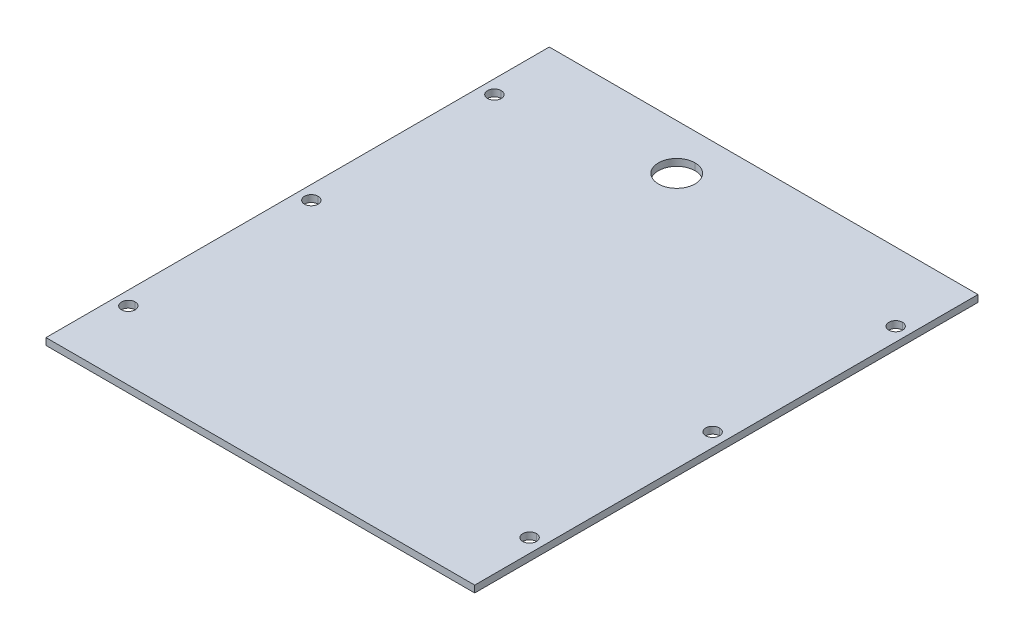
ISO-10303-21;
HEADER;
FILE_DESCRIPTION(('STEP AP214'),'2;1');
FILE_NAME('part.step','',(''),(''),'','','');
FILE_SCHEMA(('AUTOMOTIVE_DESIGN { 1 0 10303 214 1 1 1 1 }'));
ENDSEC;
DATA;
#1=APPLICATION_CONTEXT('core data for automotive mechanical design processes');
#2=APPLICATION_PROTOCOL_DEFINITION('international standard','automotive_design',2000,#1);
#3=PRODUCT_CONTEXT('',#1,'mechanical');
#4=PRODUCT('Part','Part','',(#3));
#5=PRODUCT_RELATED_PRODUCT_CATEGORY('part','',(#4));
#6=PRODUCT_DEFINITION_FORMATION('','',#4);
#7=PRODUCT_DEFINITION_CONTEXT('part definition',#1,'design');
#8=PRODUCT_DEFINITION('design','',#6,#7);
#9=PRODUCT_DEFINITION_SHAPE('','',#8);
#10=(LENGTH_UNIT() NAMED_UNIT(*) SI_UNIT(.MILLI.,.METRE.));
#11=(NAMED_UNIT(*) PLANE_ANGLE_UNIT() SI_UNIT($,.RADIAN.));
#12=(NAMED_UNIT(*) SI_UNIT($,.STERADIAN.) SOLID_ANGLE_UNIT());
#13=UNCERTAINTY_MEASURE_WITH_UNIT(LENGTH_MEASURE(1.E-05),#10,'distance_accuracy_value','');
#14=(GEOMETRIC_REPRESENTATION_CONTEXT(3) GLOBAL_UNCERTAINTY_ASSIGNED_CONTEXT((#13)) GLOBAL_UNIT_ASSIGNED_CONTEXT((#10,
#11,#12)) REPRESENTATION_CONTEXT('',''));
#15=CARTESIAN_POINT('',(0.,0.,0.));
#16=DIRECTION('',(0.,0.,1.));
#17=DIRECTION('',(1.,0.,0.));
#18=AXIS2_PLACEMENT_3D('',#15,#16,#17);
#19=CARTESIAN_POINT('',(37.85,-0.000999999999999916,-100.));
#20=DIRECTION('',(0.,1.,0.));
#21=DIRECTION('',(0.,0.,1.));
#22=AXIS2_PLACEMENT_3D('',#19,#20,#21);
#23=CYLINDRICAL_SURFACE('',#22,4.);
#24=DIRECTION('',(0.,1.,0.));
#25=VECTOR('',#24,1.);
#26=CARTESIAN_POINT('',(37.85,-0.000999999999999916,-104.));
#27=LINE('',#26,#25);
#28=CARTESIAN_POINT('',(37.85,0.,-104.));
#29=VERTEX_POINT('',#28);
#30=CARTESIAN_POINT('',(37.85,1.5,-104.));
#31=VERTEX_POINT('',#30);
#32=EDGE_CURVE('E198',#29,#31,#27,.T.);
#33=ORIENTED_EDGE('',*,*,#32,.F.);
#34=CARTESIAN_POINT('',(37.85,0.,-100.));
#35=DIRECTION('',(0.,1.,0.));
#36=DIRECTION('',(0.,0.,-1.));
#37=AXIS2_PLACEMENT_3D('',#34,#35,#36);
#38=CIRCLE('',#37,4.);
#39=CARTESIAN_POINT('',(37.85,0.,-96.));
#40=VERTEX_POINT('',#39);
#41=EDGE_CURVE('E185',#40,#29,#38,.T.);
#42=ORIENTED_EDGE('',*,*,#41,.F.);
#43=DIRECTION('',(0.,1.,0.));
#44=VECTOR('',#43,1.);
#45=CARTESIAN_POINT('',(37.85,-0.000999999999999916,-96.));
#46=LINE('',#45,#44);
#47=CARTESIAN_POINT('',(37.85,1.5,-96.));
#48=VERTEX_POINT('',#47);
#49=EDGE_CURVE('E207',#40,#48,#46,.T.);
#50=ORIENTED_EDGE('',*,*,#49,.T.);
#51=CARTESIAN_POINT('',(37.85,1.5,-100.));
#52=DIRECTION('',(0.,1.,0.));
#53=DIRECTION('',(0.,0.,1.));
#54=AXIS2_PLACEMENT_3D('',#51,#52,#53);
#55=CIRCLE('',#54,4.);
#56=EDGE_CURVE('E199',#48,#31,#55,.T.);
#57=ORIENTED_EDGE('',*,*,#56,.T.);
#58=EDGE_LOOP('',(#33,#42,#50,#57));
#59=FACE_BOUND('',#58,.T.);
#60=ADVANCED_FACE('F17',(#59),#23,.F.);
#61=CARTESIAN_POINT('',(3.,-0.000999999999999916,-95.));
#62=DIRECTION('',(0.,1.,0.));
#63=DIRECTION('',(0.,0.,1.));
#64=AXIS2_PLACEMENT_3D('',#61,#62,#63);
#65=CYLINDRICAL_SURFACE('',#64,1.5);
#66=DIRECTION('',(0.,1.,0.));
#67=VECTOR('',#66,1.);
#68=CARTESIAN_POINT('',(3.,-0.000999999999999916,-96.5));
#69=LINE('',#68,#67);
#70=CARTESIAN_POINT('',(3.,0.,-96.5));
#71=VERTEX_POINT('',#70);
#72=CARTESIAN_POINT('',(3.,1.5,-96.5));
#73=VERTEX_POINT('',#72);
#74=EDGE_CURVE('E214',#71,#73,#69,.T.);
#75=ORIENTED_EDGE('',*,*,#74,.F.);
#76=CARTESIAN_POINT('',(3.,0.,-95.));
#77=DIRECTION('',(0.,1.,0.));
#78=DIRECTION('',(0.,0.,-1.));
#79=AXIS2_PLACEMENT_3D('',#76,#77,#78);
#80=CIRCLE('',#79,1.5);
#81=CARTESIAN_POINT('',(3.,0.,-93.5));
#82=VERTEX_POINT('',#81);
#83=EDGE_CURVE('E194',#82,#71,#80,.T.);
#84=ORIENTED_EDGE('',*,*,#83,.F.);
#85=DIRECTION('',(0.,1.,0.));
#86=VECTOR('',#85,1.);
#87=CARTESIAN_POINT('',(3.,-0.000999999999999916,-93.5));
#88=LINE('',#87,#86);
#89=CARTESIAN_POINT('',(3.,1.5,-93.5));
#90=VERTEX_POINT('',#89);
#91=EDGE_CURVE('E237',#82,#90,#88,.T.);
#92=ORIENTED_EDGE('',*,*,#91,.T.);
#93=CARTESIAN_POINT('',(3.,1.5,-95.));
#94=DIRECTION('',(0.,1.,0.));
#95=DIRECTION('',(0.,0.,-1.));
#96=AXIS2_PLACEMENT_3D('',#93,#94,#95);
#97=CIRCLE('',#96,1.5);
#98=EDGE_CURVE('E371',#90,#73,#97,.T.);
#99=ORIENTED_EDGE('',*,*,#98,.T.);
#100=EDGE_LOOP('',(#75,#84,#92,#99));
#101=FACE_BOUND('',#100,.T.);
#102=ADVANCED_FACE('F434',(#101),#65,.F.);
#103=CARTESIAN_POINT('',(3.,-0.000999999999999916,-55.));
#104=DIRECTION('',(0.,1.,0.));
#105=DIRECTION('',(0.,0.,1.));
#106=AXIS2_PLACEMENT_3D('',#103,#104,#105);
#107=CYLINDRICAL_SURFACE('',#106,1.5);
#108=DIRECTION('',(0.,1.,0.));
#109=VECTOR('',#108,1.);
#110=CARTESIAN_POINT('',(3.,-0.000999999999999916,-56.5));
#111=LINE('',#110,#109);
#112=CARTESIAN_POINT('',(3.,0.,-56.5));
#113=VERTEX_POINT('',#112);
#114=CARTESIAN_POINT('',(3.,1.5,-56.5));
#115=VERTEX_POINT('',#114);
#116=EDGE_CURVE('E236',#113,#115,#111,.T.);
#117=ORIENTED_EDGE('',*,*,#116,.F.);
#118=CARTESIAN_POINT('',(3.,0.,-55.));
#119=DIRECTION('',(0.,1.,0.));
#120=DIRECTION('',(0.,0.,-1.));
#121=AXIS2_PLACEMENT_3D('',#118,#119,#120);
#122=CIRCLE('',#121,1.5);
#123=CARTESIAN_POINT('',(3.,0.,-53.5));
#124=VERTEX_POINT('',#123);
#125=EDGE_CURVE('E272',#124,#113,#122,.T.);
#126=ORIENTED_EDGE('',*,*,#125,.F.);
#127=DIRECTION('',(0.,1.,0.));
#128=VECTOR('',#127,1.);
#129=CARTESIAN_POINT('',(3.,-0.000999999999999916,-53.5));
#130=LINE('',#129,#128);
#131=CARTESIAN_POINT('',(3.,1.5,-53.5));
#132=VERTEX_POINT('',#131);
#133=EDGE_CURVE('E226',#124,#132,#130,.T.);
#134=ORIENTED_EDGE('',*,*,#133,.T.);
#135=CARTESIAN_POINT('',(3.,1.5,-55.));
#136=DIRECTION('',(0.,1.,0.));
#137=DIRECTION('',(0.,0.,-1.));
#138=AXIS2_PLACEMENT_3D('',#135,#136,#137);
#139=CIRCLE('',#138,1.5);
#140=EDGE_CURVE('E376',#132,#115,#139,.T.);
#141=ORIENTED_EDGE('',*,*,#140,.T.);
#142=EDGE_LOOP('',(#117,#126,#134,#141));
#143=FACE_BOUND('',#142,.T.);
#144=ADVANCED_FACE('F438',(#143),#107,.F.);
#145=CARTESIAN_POINT('',(3.,-0.000999999999999916,-15.));
#146=DIRECTION('',(0.,1.,0.));
#147=DIRECTION('',(0.,0.,1.));
#148=AXIS2_PLACEMENT_3D('',#145,#146,#147);
#149=CYLINDRICAL_SURFACE('',#148,1.5);
#150=DIRECTION('',(0.,1.,0.));
#151=VECTOR('',#150,1.);
#152=CARTESIAN_POINT('',(3.,-0.000999999999999916,-16.5));
#153=LINE('',#152,#151);
#154=CARTESIAN_POINT('',(3.,0.,-16.5));
#155=VERTEX_POINT('',#154);
#156=CARTESIAN_POINT('',(3.,1.5,-16.5));
#157=VERTEX_POINT('',#156);
#158=EDGE_CURVE('E259',#155,#157,#153,.T.);
#159=ORIENTED_EDGE('',*,*,#158,.F.);
#160=CARTESIAN_POINT('',(3.,0.,-15.));
#161=DIRECTION('',(0.,1.,0.));
#162=DIRECTION('',(0.,0.,-1.));
#163=AXIS2_PLACEMENT_3D('',#160,#161,#162);
#164=CIRCLE('',#163,1.5);
#165=CARTESIAN_POINT('',(3.,0.,-13.5));
#166=VERTEX_POINT('',#165);
#167=EDGE_CURVE('E275',#166,#155,#164,.T.);
#168=ORIENTED_EDGE('',*,*,#167,.F.);
#169=DIRECTION('',(0.,1.,0.));
#170=VECTOR('',#169,1.);
#171=CARTESIAN_POINT('',(3.,-0.000999999999999916,-13.5));
#172=LINE('',#171,#170);
#173=CARTESIAN_POINT('',(3.,1.5,-13.5));
#174=VERTEX_POINT('',#173);
#175=EDGE_CURVE('E250',#166,#174,#172,.T.);
#176=ORIENTED_EDGE('',*,*,#175,.T.);
#177=CARTESIAN_POINT('',(3.,1.5,-15.));
#178=DIRECTION('',(0.,1.,0.));
#179=DIRECTION('',(0.,0.,-1.));
#180=AXIS2_PLACEMENT_3D('',#177,#178,#179);
#181=CIRCLE('',#180,1.5);
#182=EDGE_CURVE('E379',#174,#157,#181,.T.);
#183=ORIENTED_EDGE('',*,*,#182,.T.);
#184=EDGE_LOOP('',(#159,#168,#176,#183));
#185=FACE_BOUND('',#184,.T.);
#186=ADVANCED_FACE('F394',(#185),#149,.F.);
#187=CARTESIAN_POINT('',(90.7,-0.000999999999999916,-15.));
#188=DIRECTION('',(0.,1.,0.));
#189=DIRECTION('',(0.,0.,1.));
#190=AXIS2_PLACEMENT_3D('',#187,#188,#189);
#191=CYLINDRICAL_SURFACE('',#190,1.5);
#192=DIRECTION('',(0.,1.,0.));
#193=VECTOR('',#192,1.);
#194=CARTESIAN_POINT('',(90.7,-0.000999999999999916,-16.5));
#195=LINE('',#194,#193);
#196=CARTESIAN_POINT('',(90.7,0.,-16.5));
#197=VERTEX_POINT('',#196);
#198=CARTESIAN_POINT('',(90.7,1.5,-16.5));
#199=VERTEX_POINT('',#198);
#200=EDGE_CURVE('E297',#197,#199,#195,.T.);
#201=ORIENTED_EDGE('',*,*,#200,.F.);
#202=CARTESIAN_POINT('',(90.7,0.,-15.));
#203=DIRECTION('',(0.,1.,0.));
#204=DIRECTION('',(0.,0.,-1.));
#205=AXIS2_PLACEMENT_3D('',#202,#203,#204);
#206=CIRCLE('',#205,1.5);
#207=CARTESIAN_POINT('',(90.7,0.,-13.5));
#208=VERTEX_POINT('',#207);
#209=EDGE_CURVE('E268',#208,#197,#206,.T.);
#210=ORIENTED_EDGE('',*,*,#209,.F.);
#211=DIRECTION('',(0.,1.,0.));
#212=VECTOR('',#211,1.);
#213=CARTESIAN_POINT('',(90.7,-0.000999999999999916,-13.5));
#214=LINE('',#213,#212);
#215=CARTESIAN_POINT('',(90.7,1.5,-13.5));
#216=VERTEX_POINT('',#215);
#217=EDGE_CURVE('E305',#208,#216,#214,.T.);
#218=ORIENTED_EDGE('',*,*,#217,.T.);
#219=CARTESIAN_POINT('',(90.7,1.5,-15.));
#220=DIRECTION('',(0.,1.,0.));
#221=DIRECTION('',(0.,0.,1.));
#222=AXIS2_PLACEMENT_3D('',#219,#220,#221);
#223=CIRCLE('',#222,1.5);
#224=EDGE_CURVE('E241',#216,#199,#223,.T.);
#225=ORIENTED_EDGE('',*,*,#224,.T.);
#226=EDGE_LOOP('',(#201,#210,#218,#225));
#227=FACE_BOUND('',#226,.T.);
#228=ADVANCED_FACE('F446',(#227),#191,.F.);
#229=CARTESIAN_POINT('',(90.7,-0.000999999999999916,-55.));
#230=DIRECTION('',(0.,1.,0.));
#231=DIRECTION('',(0.,0.,1.));
#232=AXIS2_PLACEMENT_3D('',#229,#230,#231);
#233=CYLINDRICAL_SURFACE('',#232,1.5);
#234=DIRECTION('',(0.,1.,0.));
#235=VECTOR('',#234,1.);
#236=CARTESIAN_POINT('',(90.7,-0.000999999999999916,-56.5));
#237=LINE('',#236,#235);
#238=CARTESIAN_POINT('',(90.7,0.,-56.5));
#239=VERTEX_POINT('',#238);
#240=CARTESIAN_POINT('',(90.7,1.5,-56.5));
#241=VERTEX_POINT('',#240);
#242=EDGE_CURVE('E318',#239,#241,#237,.T.);
#243=ORIENTED_EDGE('',*,*,#242,.F.);
#244=CARTESIAN_POINT('',(90.7,0.,-55.));
#245=DIRECTION('',(0.,1.,0.));
#246=DIRECTION('',(0.,0.,-1.));
#247=AXIS2_PLACEMENT_3D('',#244,#245,#246);
#248=CIRCLE('',#247,1.5);
#249=CARTESIAN_POINT('',(90.7,0.,-53.5));
#250=VERTEX_POINT('',#249);
#251=EDGE_CURVE('E25',#250,#239,#248,.T.);
#252=ORIENTED_EDGE('',*,*,#251,.F.);
#253=DIRECTION('',(0.,1.,0.));
#254=VECTOR('',#253,1.);
#255=CARTESIAN_POINT('',(90.7,-0.000999999999999916,-53.5));
#256=LINE('',#255,#254);
#257=CARTESIAN_POINT('',(90.7,1.5,-53.5));
#258=VERTEX_POINT('',#257);
#259=EDGE_CURVE('E328',#250,#258,#256,.T.);
#260=ORIENTED_EDGE('',*,*,#259,.T.);
#261=CARTESIAN_POINT('',(90.7,1.5,-55.));
#262=DIRECTION('',(0.,1.,0.));
#263=DIRECTION('',(0.,0.,1.));
#264=AXIS2_PLACEMENT_3D('',#261,#262,#263);
#265=CIRCLE('',#264,1.5);
#266=EDGE_CURVE('E238',#258,#241,#265,.T.);
#267=ORIENTED_EDGE('',*,*,#266,.T.);
#268=EDGE_LOOP('',(#243,#252,#260,#267));
#269=FACE_BOUND('',#268,.T.);
#270=ADVANCED_FACE('F428',(#269),#233,.F.);
#271=CARTESIAN_POINT('',(90.7,-0.000999999999999916,-95.));
#272=DIRECTION('',(0.,1.,0.));
#273=DIRECTION('',(0.,0.,1.));
#274=AXIS2_PLACEMENT_3D('',#271,#272,#273);
#275=CYLINDRICAL_SURFACE('',#274,1.5);
#276=DIRECTION('',(0.,1.,0.));
#277=VECTOR('',#276,1.);
#278=CARTESIAN_POINT('',(90.7,-0.000999999999999916,-96.5));
#279=LINE('',#278,#277);
#280=CARTESIAN_POINT('',(90.7,0.,-96.5));
#281=VERTEX_POINT('',#280);
#282=CARTESIAN_POINT('',(90.7,1.5,-96.5));
#283=VERTEX_POINT('',#282);
#284=EDGE_CURVE('E336',#281,#283,#279,.T.);
#285=ORIENTED_EDGE('',*,*,#284,.F.);
#286=CARTESIAN_POINT('',(90.7,0.,-95.));
#287=DIRECTION('',(0.,1.,0.));
#288=DIRECTION('',(0.,0.,-1.));
#289=AXIS2_PLACEMENT_3D('',#286,#287,#288);
#290=CIRCLE('',#289,1.5);
#291=CARTESIAN_POINT('',(90.7,0.,-93.5));
#292=VERTEX_POINT('',#291);
#293=EDGE_CURVE('E11',#292,#281,#290,.T.);
#294=ORIENTED_EDGE('',*,*,#293,.F.);
#295=DIRECTION('',(0.,1.,0.));
#296=VECTOR('',#295,1.);
#297=CARTESIAN_POINT('',(90.7,-0.000999999999999916,-93.5));
#298=LINE('',#297,#296);
#299=CARTESIAN_POINT('',(90.7,1.5,-93.5));
#300=VERTEX_POINT('',#299);
#301=EDGE_CURVE('E288',#292,#300,#298,.T.);
#302=ORIENTED_EDGE('',*,*,#301,.T.);
#303=CARTESIAN_POINT('',(90.7,1.5,-95.));
#304=DIRECTION('',(0.,1.,0.));
#305=DIRECTION('',(0.,0.,1.));
#306=AXIS2_PLACEMENT_3D('',#303,#304,#305);
#307=CIRCLE('',#306,1.5);
#308=EDGE_CURVE('E195',#300,#283,#307,.T.);
#309=ORIENTED_EDGE('',*,*,#308,.T.);
#310=EDGE_LOOP('',(#285,#294,#302,#309));
#311=FACE_BOUND('',#310,.T.);
#312=ADVANCED_FACE('F421',(#311),#275,.F.);
#313=CARTESIAN_POINT('',(0.,0.,0.));
#314=DIRECTION('',(0.,-1.,0.));
#315=DIRECTION('',(0.,0.,-1.));
#316=AXIS2_PLACEMENT_3D('',#313,#314,#315);
#317=PLANE('',#316);
#318=ORIENTED_EDGE('',*,*,#293,.T.);
#319=CARTESIAN_POINT('',(90.7,0.,-95.));
#320=DIRECTION('',(0.,1.,0.));
#321=DIRECTION('',(0.,0.,-1.));
#322=AXIS2_PLACEMENT_3D('',#319,#320,#321);
#323=CIRCLE('',#322,1.5);
#324=EDGE_CURVE('E332',#281,#292,#323,.T.);
#325=ORIENTED_EDGE('',*,*,#324,.T.);
#326=EDGE_LOOP('',(#318,#325));
#327=FACE_BOUND('',#326,.T.);
#328=ORIENTED_EDGE('',*,*,#251,.T.);
#329=CARTESIAN_POINT('',(90.7,0.,-55.));
#330=DIRECTION('',(0.,1.,0.));
#331=DIRECTION('',(0.,0.,-1.));
#332=AXIS2_PLACEMENT_3D('',#329,#330,#331);
#333=CIRCLE('',#332,1.5);
#334=EDGE_CURVE('E309',#239,#250,#333,.T.);
#335=ORIENTED_EDGE('',*,*,#334,.T.);
#336=EDGE_LOOP('',(#328,#335));
#337=FACE_BOUND('',#336,.T.);
#338=ORIENTED_EDGE('',*,*,#209,.T.);
#339=CARTESIAN_POINT('',(90.7,0.,-15.));
#340=DIRECTION('',(0.,1.,0.));
#341=DIRECTION('',(0.,0.,-1.));
#342=AXIS2_PLACEMENT_3D('',#339,#340,#341);
#343=CIRCLE('',#342,1.5);
#344=EDGE_CURVE('E254',#197,#208,#343,.T.);
#345=ORIENTED_EDGE('',*,*,#344,.T.);
#346=EDGE_LOOP('',(#338,#345));
#347=FACE_BOUND('',#346,.T.);
#348=ORIENTED_EDGE('',*,*,#167,.T.);
#349=CARTESIAN_POINT('',(3.,0.,-15.));
#350=DIRECTION('',(0.,1.,0.));
#351=DIRECTION('',(0.,0.,-1.));
#352=AXIS2_PLACEMENT_3D('',#349,#350,#351);
#353=CIRCLE('',#352,1.5);
#354=EDGE_CURVE('E230',#155,#166,#353,.T.);
#355=ORIENTED_EDGE('',*,*,#354,.T.);
#356=EDGE_LOOP('',(#348,#355));
#357=FACE_BOUND('',#356,.T.);
#358=ORIENTED_EDGE('',*,*,#125,.T.);
#359=CARTESIAN_POINT('',(3.,0.,-55.));
#360=DIRECTION('',(0.,1.,0.));
#361=DIRECTION('',(0.,0.,-1.));
#362=AXIS2_PLACEMENT_3D('',#359,#360,#361);
#363=CIRCLE('',#362,1.5);
#364=EDGE_CURVE('E232',#113,#124,#363,.T.);
#365=ORIENTED_EDGE('',*,*,#364,.T.);
#366=EDGE_LOOP('',(#358,#365));
#367=FACE_BOUND('',#366,.T.);
#368=ORIENTED_EDGE('',*,*,#83,.T.);
#369=CARTESIAN_POINT('',(3.,0.,-95.));
#370=DIRECTION('',(0.,1.,0.));
#371=DIRECTION('',(0.,0.,-1.));
#372=AXIS2_PLACEMENT_3D('',#369,#370,#371);
#373=CIRCLE('',#372,1.5);
#374=EDGE_CURVE('E219',#71,#82,#373,.T.);
#375=ORIENTED_EDGE('',*,*,#374,.T.);
#376=EDGE_LOOP('',(#368,#375));
#377=FACE_BOUND('',#376,.T.);
#378=ORIENTED_EDGE('',*,*,#41,.T.);
#379=CARTESIAN_POINT('',(37.85,0.,-100.));
#380=DIRECTION('',(0.,1.,0.));
#381=DIRECTION('',(0.,0.,-1.));
#382=AXIS2_PLACEMENT_3D('',#379,#380,#381);
#383=CIRCLE('',#382,4.);
#384=EDGE_CURVE('E189',#29,#40,#383,.T.);
#385=ORIENTED_EDGE('',*,*,#384,.T.);
#386=EDGE_LOOP('',(#378,#385));
#387=FACE_BOUND('',#386,.T.);
#388=DIRECTION('',(0.,0.,1.));
#389=VECTOR('',#388,1.);
#390=CARTESIAN_POINT('',(0.,0.,0.));
#391=LINE('',#390,#389);
#392=CARTESIAN_POINT('',(0.,0.,-110.));
#393=VERTEX_POINT('',#392);
#394=CARTESIAN_POINT('',(0.,0.,0.));
#395=VERTEX_POINT('',#394);
#396=EDGE_CURVE('E292',#393,#395,#391,.T.);
#397=ORIENTED_EDGE('',*,*,#396,.F.);
#398=DIRECTION('',(-1.,0.,0.));
#399=VECTOR('',#398,1.);
#400=CARTESIAN_POINT('',(0.,0.,-110.));
#401=LINE('',#400,#399);
#402=CARTESIAN_POINT('',(93.7,0.,-110.));
#403=VERTEX_POINT('',#402);
#404=EDGE_CURVE('E49',#403,#393,#401,.T.);
#405=ORIENTED_EDGE('',*,*,#404,.F.);
#406=DIRECTION('',(0.,0.,-1.));
#407=VECTOR('',#406,1.);
#408=CARTESIAN_POINT('',(93.7,0.,0.));
#409=LINE('',#408,#407);
#410=CARTESIAN_POINT('',(93.7,0.,0.));
#411=VERTEX_POINT('',#410);
#412=EDGE_CURVE('E359',#411,#403,#409,.T.);
#413=ORIENTED_EDGE('',*,*,#412,.F.);
#414=DIRECTION('',(1.,0.,0.));
#415=VECTOR('',#414,1.);
#416=CARTESIAN_POINT('',(0.,0.,0.));
#417=LINE('',#416,#415);
#418=EDGE_CURVE('E247',#395,#411,#417,.T.);
#419=ORIENTED_EDGE('',*,*,#418,.F.);
#420=EDGE_LOOP('',(#397,#405,#413,#419));
#421=FACE_BOUND('',#420,.T.);
#422=ADVANCED_FACE('F187',(#327,#337,#347,#357,#367,#377,#387,#421),#317,.T.);
#423=CARTESIAN_POINT('',(0.,1.5,0.));
#424=DIRECTION('',(0.,-1.,0.));
#425=DIRECTION('',(0.,0.,-1.));
#426=AXIS2_PLACEMENT_3D('',#423,#424,#425);
#427=PLANE('',#426);
#428=ORIENTED_EDGE('',*,*,#308,.F.);
#429=CARTESIAN_POINT('',(90.7,1.5,-95.));
#430=DIRECTION('',(0.,1.,0.));
#431=DIRECTION('',(0.,0.,1.));
#432=AXIS2_PLACEMENT_3D('',#429,#430,#431);
#433=CIRCLE('',#432,1.5);
#434=EDGE_CURVE('E293',#283,#300,#433,.T.);
#435=ORIENTED_EDGE('',*,*,#434,.F.);
#436=EDGE_LOOP('',(#428,#435));
#437=FACE_BOUND('',#436,.T.);
#438=ORIENTED_EDGE('',*,*,#266,.F.);
#439=CARTESIAN_POINT('',(90.7,1.5,-55.));
#440=DIRECTION('',(0.,1.,0.));
#441=DIRECTION('',(0.,0.,1.));
#442=AXIS2_PLACEMENT_3D('',#439,#440,#441);
#443=CIRCLE('',#442,1.5);
#444=EDGE_CURVE('E324',#241,#258,#443,.T.);
#445=ORIENTED_EDGE('',*,*,#444,.F.);
#446=EDGE_LOOP('',(#438,#445));
#447=FACE_BOUND('',#446,.T.);
#448=ORIENTED_EDGE('',*,*,#224,.F.);
#449=CARTESIAN_POINT('',(90.7,1.5,-15.));
#450=DIRECTION('',(0.,1.,0.));
#451=DIRECTION('',(0.,0.,1.));
#452=AXIS2_PLACEMENT_3D('',#449,#450,#451);
#453=CIRCLE('',#452,1.5);
#454=EDGE_CURVE('E301',#199,#216,#453,.T.);
#455=ORIENTED_EDGE('',*,*,#454,.F.);
#456=EDGE_LOOP('',(#448,#455));
#457=FACE_BOUND('',#456,.T.);
#458=ORIENTED_EDGE('',*,*,#182,.F.);
#459=CARTESIAN_POINT('',(3.,1.5,-15.));
#460=DIRECTION('',(0.,1.,0.));
#461=DIRECTION('',(0.,0.,-1.));
#462=AXIS2_PLACEMENT_3D('',#459,#460,#461);
#463=CIRCLE('',#462,1.5);
#464=EDGE_CURVE('E255',#157,#174,#463,.T.);
#465=ORIENTED_EDGE('',*,*,#464,.F.);
#466=EDGE_LOOP('',(#458,#465));
#467=FACE_BOUND('',#466,.T.);
#468=ORIENTED_EDGE('',*,*,#140,.F.);
#469=CARTESIAN_POINT('',(3.,1.5,-55.));
#470=DIRECTION('',(0.,1.,0.));
#471=DIRECTION('',(0.,0.,-1.));
#472=AXIS2_PLACEMENT_3D('',#469,#470,#471);
#473=CIRCLE('',#472,1.5);
#474=EDGE_CURVE('E231',#115,#132,#473,.T.);
#475=ORIENTED_EDGE('',*,*,#474,.F.);
#476=EDGE_LOOP('',(#468,#475));
#477=FACE_BOUND('',#476,.T.);
#478=ORIENTED_EDGE('',*,*,#98,.F.);
#479=CARTESIAN_POINT('',(3.,1.5,-95.));
#480=DIRECTION('',(0.,1.,0.));
#481=DIRECTION('',(0.,0.,-1.));
#482=AXIS2_PLACEMENT_3D('',#479,#480,#481);
#483=CIRCLE('',#482,1.5);
#484=EDGE_CURVE('E218',#73,#90,#483,.T.);
#485=ORIENTED_EDGE('',*,*,#484,.F.);
#486=EDGE_LOOP('',(#478,#485));
#487=FACE_BOUND('',#486,.T.);
#488=ORIENTED_EDGE('',*,*,#56,.F.);
#489=CARTESIAN_POINT('',(37.85,1.5,-100.));
#490=DIRECTION('',(0.,1.,0.));
#491=DIRECTION('',(0.,0.,1.));
#492=AXIS2_PLACEMENT_3D('',#489,#490,#491);
#493=CIRCLE('',#492,4.);
#494=EDGE_CURVE('E204',#31,#48,#493,.T.);
#495=ORIENTED_EDGE('',*,*,#494,.F.);
#496=EDGE_LOOP('',(#488,#495));
#497=FACE_BOUND('',#496,.T.);
#498=DIRECTION('',(0.,0.,1.));
#499=VECTOR('',#498,1.);
#500=CARTESIAN_POINT('',(0.,1.5,0.));
#501=LINE('',#500,#499);
#502=CARTESIAN_POINT('',(0.,1.5,-110.));
#503=VERTEX_POINT('',#502);
#504=CARTESIAN_POINT('',(0.,1.5,0.));
#505=VERTEX_POINT('',#504);
#506=EDGE_CURVE('E314',#503,#505,#501,.T.);
#507=ORIENTED_EDGE('',*,*,#506,.T.);
#508=DIRECTION('',(1.,0.,0.));
#509=VECTOR('',#508,1.);
#510=CARTESIAN_POINT('',(0.,1.5,0.));
#511=LINE('',#510,#509);
#512=CARTESIAN_POINT('',(93.7,1.5,0.));
#513=VERTEX_POINT('',#512);
#514=EDGE_CURVE('E246',#505,#513,#511,.T.);
#515=ORIENTED_EDGE('',*,*,#514,.T.);
#516=DIRECTION('',(0.,0.,-1.));
#517=VECTOR('',#516,1.);
#518=CARTESIAN_POINT('',(93.7,1.5,0.));
#519=LINE('',#518,#517);
#520=CARTESIAN_POINT('',(93.7,1.5,-110.));
#521=VERTEX_POINT('',#520);
#522=EDGE_CURVE('E220',#513,#521,#519,.T.);
#523=ORIENTED_EDGE('',*,*,#522,.T.);
#524=DIRECTION('',(-1.,0.,0.));
#525=VECTOR('',#524,1.);
#526=CARTESIAN_POINT('',(0.,1.5,-110.));
#527=LINE('',#526,#525);
#528=EDGE_CURVE('E38',#521,#503,#527,.T.);
#529=ORIENTED_EDGE('',*,*,#528,.T.);
#530=EDGE_LOOP('',(#507,#515,#523,#529));
#531=FACE_BOUND('',#530,.T.);
#532=ADVANCED_FACE('F399',(#437,#447,#457,#467,#477,#487,#497,#531),#427,.F.);
#533=CARTESIAN_POINT('',(0.,1.5,-110.));
#534=DIRECTION('',(0.,0.,1.));
#535=DIRECTION('',(1.,0.,0.));
#536=AXIS2_PLACEMENT_3D('',#533,#534,#535);
#537=PLANE('',#536);
#538=ORIENTED_EDGE('',*,*,#404,.T.);
#539=DIRECTION('',(0.,-1.,0.));
#540=VECTOR('',#539,1.);
#541=CARTESIAN_POINT('',(0.,1.5,-110.));
#542=LINE('',#541,#540);
#543=EDGE_CURVE('E310',#503,#393,#542,.T.);
#544=ORIENTED_EDGE('',*,*,#543,.F.);
#545=ORIENTED_EDGE('',*,*,#528,.F.);
#546=DIRECTION('',(0.,-1.,0.));
#547=VECTOR('',#546,1.);
#548=CARTESIAN_POINT('',(93.7,1.5,-110.));
#549=LINE('',#548,#547);
#550=EDGE_CURVE('E223',#521,#403,#549,.T.);
#551=ORIENTED_EDGE('',*,*,#550,.T.);
#552=EDGE_LOOP('',(#538,#544,#545,#551));
#553=FACE_BOUND('',#552,.T.);
#554=ADVANCED_FACE('F402',(#553),#537,.F.);
#555=CARTESIAN_POINT('',(93.7,1.5,0.));
#556=DIRECTION('',(-1.,0.,0.));
#557=DIRECTION('',(0.,0.,1.));
#558=AXIS2_PLACEMENT_3D('',#555,#556,#557);
#559=PLANE('',#558);
#560=ORIENTED_EDGE('',*,*,#412,.T.);
#561=ORIENTED_EDGE('',*,*,#550,.F.);
#562=ORIENTED_EDGE('',*,*,#522,.F.);
#563=DIRECTION('',(0.,-1.,0.));
#564=VECTOR('',#563,1.);
#565=CARTESIAN_POINT('',(93.7,1.5,0.));
#566=LINE('',#565,#564);
#567=EDGE_CURVE('E242',#513,#411,#566,.T.);
#568=ORIENTED_EDGE('',*,*,#567,.T.);
#569=EDGE_LOOP('',(#560,#561,#562,#568));
#570=FACE_BOUND('',#569,.T.);
#571=ADVANCED_FACE('F418',(#570),#559,.F.);
#572=CARTESIAN_POINT('',(0.,1.5,0.));
#573=DIRECTION('',(0.,0.,-1.));
#574=DIRECTION('',(0.,-1.,0.));
#575=AXIS2_PLACEMENT_3D('',#572,#573,#574);
#576=PLANE('',#575);
#577=ORIENTED_EDGE('',*,*,#418,.T.);
#578=ORIENTED_EDGE('',*,*,#567,.F.);
#579=ORIENTED_EDGE('',*,*,#514,.F.);
#580=DIRECTION('',(0.,-1.,0.));
#581=VECTOR('',#580,1.);
#582=CARTESIAN_POINT('',(0.,1.5,0.));
#583=LINE('',#582,#581);
#584=EDGE_CURVE('E345',#505,#395,#583,.T.);
#585=ORIENTED_EDGE('',*,*,#584,.T.);
#586=EDGE_LOOP('',(#577,#578,#579,#585));
#587=FACE_BOUND('',#586,.T.);
#588=ADVANCED_FACE('F416',(#587),#576,.F.);
#589=CARTESIAN_POINT('',(0.,1.5,0.));
#590=DIRECTION('',(1.,0.,0.));
#591=DIRECTION('',(0.,1.,0.));
#592=AXIS2_PLACEMENT_3D('',#589,#590,#591);
#593=PLANE('',#592);
#594=ORIENTED_EDGE('',*,*,#396,.T.);
#595=ORIENTED_EDGE('',*,*,#584,.F.);
#596=ORIENTED_EDGE('',*,*,#506,.F.);
#597=ORIENTED_EDGE('',*,*,#543,.T.);
#598=EDGE_LOOP('',(#594,#595,#596,#597));
#599=FACE_BOUND('',#598,.T.);
#600=ADVANCED_FACE('F414',(#599),#593,.F.);
#601=CARTESIAN_POINT('',(90.7,-0.000999999999999916,-95.));
#602=DIRECTION('',(0.,1.,0.));
#603=DIRECTION('',(0.,0.,1.));
#604=AXIS2_PLACEMENT_3D('',#601,#602,#603);
#605=CYLINDRICAL_SURFACE('',#604,1.5);
#606=ORIENTED_EDGE('',*,*,#324,.F.);
#607=ORIENTED_EDGE('',*,*,#284,.T.);
#608=ORIENTED_EDGE('',*,*,#434,.T.);
#609=ORIENTED_EDGE('',*,*,#301,.F.);
#610=EDGE_LOOP('',(#606,#607,#608,#609));
#611=FACE_BOUND('',#610,.T.);
#612=ADVANCED_FACE('F530',(#611),#605,.F.);
#613=CARTESIAN_POINT('',(90.7,-0.000999999999999916,-55.));
#614=DIRECTION('',(0.,1.,0.));
#615=DIRECTION('',(0.,0.,1.));
#616=AXIS2_PLACEMENT_3D('',#613,#614,#615);
#617=CYLINDRICAL_SURFACE('',#616,1.5);
#618=ORIENTED_EDGE('',*,*,#334,.F.);
#619=ORIENTED_EDGE('',*,*,#242,.T.);
#620=ORIENTED_EDGE('',*,*,#444,.T.);
#621=ORIENTED_EDGE('',*,*,#259,.F.);
#622=EDGE_LOOP('',(#618,#619,#620,#621));
#623=FACE_BOUND('',#622,.T.);
#624=ADVANCED_FACE('F540',(#623),#617,.F.);
#625=CARTESIAN_POINT('',(90.7,-0.000999999999999916,-15.));
#626=DIRECTION('',(0.,1.,0.));
#627=DIRECTION('',(0.,0.,1.));
#628=AXIS2_PLACEMENT_3D('',#625,#626,#627);
#629=CYLINDRICAL_SURFACE('',#628,1.5);
#630=ORIENTED_EDGE('',*,*,#344,.F.);
#631=ORIENTED_EDGE('',*,*,#200,.T.);
#632=ORIENTED_EDGE('',*,*,#454,.T.);
#633=ORIENTED_EDGE('',*,*,#217,.F.);
#634=EDGE_LOOP('',(#630,#631,#632,#633));
#635=FACE_BOUND('',#634,.T.);
#636=ADVANCED_FACE('F551',(#635),#629,.F.);
#637=CARTESIAN_POINT('',(3.,-0.000999999999999916,-15.));
#638=DIRECTION('',(0.,1.,0.));
#639=DIRECTION('',(0.,0.,1.));
#640=AXIS2_PLACEMENT_3D('',#637,#638,#639);
#641=CYLINDRICAL_SURFACE('',#640,1.5);
#642=ORIENTED_EDGE('',*,*,#354,.F.);
#643=ORIENTED_EDGE('',*,*,#158,.T.);
#644=ORIENTED_EDGE('',*,*,#464,.T.);
#645=ORIENTED_EDGE('',*,*,#175,.F.);
#646=EDGE_LOOP('',(#642,#643,#644,#645));
#647=FACE_BOUND('',#646,.T.);
#648=ADVANCED_FACE('F397',(#647),#641,.F.);
#649=CARTESIAN_POINT('',(3.,-0.000999999999999916,-55.));
#650=DIRECTION('',(0.,1.,0.));
#651=DIRECTION('',(0.,0.,1.));
#652=AXIS2_PLACEMENT_3D('',#649,#650,#651);
#653=CYLINDRICAL_SURFACE('',#652,1.5);
#654=ORIENTED_EDGE('',*,*,#364,.F.);
#655=ORIENTED_EDGE('',*,*,#116,.T.);
#656=ORIENTED_EDGE('',*,*,#474,.T.);
#657=ORIENTED_EDGE('',*,*,#133,.F.);
#658=EDGE_LOOP('',(#654,#655,#656,#657));
#659=FACE_BOUND('',#658,.T.);
#660=ADVANCED_FACE('F571',(#659),#653,.F.);
#661=CARTESIAN_POINT('',(3.,-0.000999999999999916,-95.));
#662=DIRECTION('',(0.,1.,0.));
#663=DIRECTION('',(0.,0.,1.));
#664=AXIS2_PLACEMENT_3D('',#661,#662,#663);
#665=CYLINDRICAL_SURFACE('',#664,1.5);
#666=ORIENTED_EDGE('',*,*,#374,.F.);
#667=ORIENTED_EDGE('',*,*,#74,.T.);
#668=ORIENTED_EDGE('',*,*,#484,.T.);
#669=ORIENTED_EDGE('',*,*,#91,.F.);
#670=EDGE_LOOP('',(#666,#667,#668,#669));
#671=FACE_BOUND('',#670,.T.);
#672=ADVANCED_FACE('F581',(#671),#665,.F.);
#673=CARTESIAN_POINT('',(37.85,-0.000999999999999916,-100.));
#674=DIRECTION('',(0.,1.,0.));
#675=DIRECTION('',(0.,0.,1.));
#676=AXIS2_PLACEMENT_3D('',#673,#674,#675);
#677=CYLINDRICAL_SURFACE('',#676,4.);
#678=ORIENTED_EDGE('',*,*,#384,.F.);
#679=ORIENTED_EDGE('',*,*,#32,.T.);
#680=ORIENTED_EDGE('',*,*,#494,.T.);
#681=ORIENTED_EDGE('',*,*,#49,.F.);
#682=EDGE_LOOP('',(#678,#679,#680,#681));
#683=FACE_BOUND('',#682,.T.);
#684=ADVANCED_FACE('F206',(#683),#677,.F.);
#685=CLOSED_SHELL('',(#60,#102,#144,#186,#228,#270,#312,#422,#532,#554,#571,#588,#600,#612,#624,
#636,#648,#660,#672,#684));
#686=MANIFOLD_SOLID_BREP('B1',#685);
#687=ADVANCED_BREP_SHAPE_REPRESENTATION('',(#18,#686),#14);
#688=SHAPE_DEFINITION_REPRESENTATION(#9,#687);
ENDSEC;
END-ISO-10303-21;
